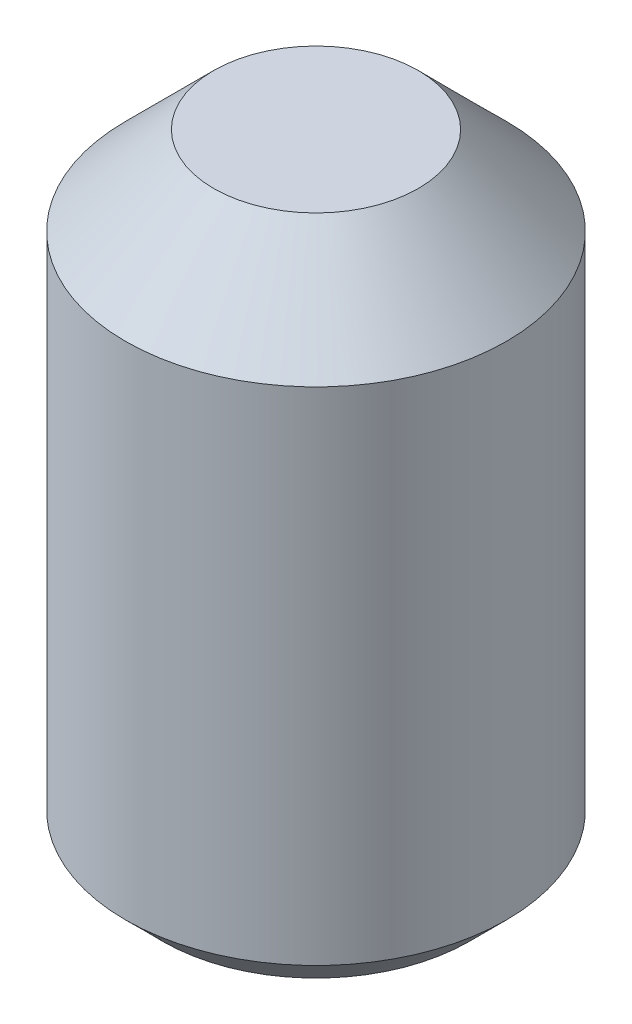
ISO-10303-21;
HEADER;
FILE_DESCRIPTION(('STEP AP214'),'2;1');
FILE_NAME('part.step','',(''),(''),'','','');
FILE_SCHEMA(('AUTOMOTIVE_DESIGN { 1 0 10303 214 1 1 1 1 }'));
ENDSEC;
DATA;
#1=APPLICATION_CONTEXT('core data for automotive mechanical design processes');
#2=APPLICATION_PROTOCOL_DEFINITION('international standard','automotive_design',2000,#1);
#3=PRODUCT_CONTEXT('',#1,'mechanical');
#4=PRODUCT('Part','Part','',(#3));
#5=PRODUCT_RELATED_PRODUCT_CATEGORY('part','',(#4));
#6=PRODUCT_DEFINITION_FORMATION('','',#4);
#7=PRODUCT_DEFINITION_CONTEXT('part definition',#1,'design');
#8=PRODUCT_DEFINITION('design','',#6,#7);
#9=PRODUCT_DEFINITION_SHAPE('','',#8);
#10=(LENGTH_UNIT() NAMED_UNIT(*) SI_UNIT(.MILLI.,.METRE.));
#11=(NAMED_UNIT(*) PLANE_ANGLE_UNIT() SI_UNIT($,.RADIAN.));
#12=(NAMED_UNIT(*) SI_UNIT($,.STERADIAN.) SOLID_ANGLE_UNIT());
#13=UNCERTAINTY_MEASURE_WITH_UNIT(LENGTH_MEASURE(1.E-05),#10,'distance_accuracy_value','');
#14=(GEOMETRIC_REPRESENTATION_CONTEXT(3) GLOBAL_UNCERTAINTY_ASSIGNED_CONTEXT((#13)) GLOBAL_UNIT_ASSIGNED_CONTEXT((#10,
#11,#12)) REPRESENTATION_CONTEXT('',''));
#15=CARTESIAN_POINT('',(0.,0.,0.));
#16=DIRECTION('',(0.,0.,1.));
#17=DIRECTION('',(1.,0.,0.));
#18=AXIS2_PLACEMENT_3D('',#15,#16,#17);
#19=CARTESIAN_POINT('',(0.,0.,0.));
#20=DIRECTION('',(0.,1.,0.));
#21=DIRECTION('',(-1.,0.,0.));
#22=AXIS2_PLACEMENT_3D('',#19,#20,#21);
#23=CYLINDRICAL_SURFACE('',#22,2.413);
#24=CARTESIAN_POINT('',(0.,0.472439999953159,0.));
#25=DIRECTION('',(0.,-1.,0.));
#26=DIRECTION('',(1.,0.,0.));
#27=AXIS2_PLACEMENT_3D('',#24,#25,#26);
#28=CIRCLE('',#27,2.413);
#29=CARTESIAN_POINT('',(2.413,0.472439999953159,0.));
#30=VERTEX_POINT('',#29);
#31=EDGE_CURVE('E45',#30,#30,#28,.F.);
#32=ORIENTED_EDGE('',*,*,#31,.T.);
#33=EDGE_LOOP('',(#32));
#34=FACE_BOUND('',#33,.T.);
#35=CARTESIAN_POINT('',(0.,6.8199,0.));
#36=DIRECTION('',(0.,1.,0.));
#37=DIRECTION('',(-1.,0.,0.));
#38=AXIS2_PLACEMENT_3D('',#35,#36,#37);
#39=CIRCLE('',#38,2.413);
#40=CARTESIAN_POINT('',(-2.413,6.8199,0.));
#41=VERTEX_POINT('',#40);
#42=EDGE_CURVE('E156',#41,#41,#39,.T.);
#43=ORIENTED_EDGE('',*,*,#42,.F.);
#44=EDGE_LOOP('',(#43));
#45=FACE_BOUND('',#44,.T.);
#46=ADVANCED_FACE('F36',(#34,#45),#23,.T.);
#47=CARTESIAN_POINT('',(2.413,0.,0.));
#48=DIRECTION('',(0.,-1.,0.));
#49=DIRECTION('',(1.,0.,0.));
#50=AXIS2_PLACEMENT_3D('',#47,#48,#49);
#51=PLANE('',#50);
#52=CARTESIAN_POINT('',(0.,0.,0.));
#53=DIRECTION('',(0.,-1.,0.));
#54=DIRECTION('',(1.,0.,0.));
#55=AXIS2_PLACEMENT_3D('',#52,#53,#54);
#56=CIRCLE('',#55,1.94056000004684);
#57=CARTESIAN_POINT('',(1.94056000004684,0.,0.));
#58=VERTEX_POINT('',#57);
#59=EDGE_CURVE('E11',#58,#58,#56,.T.);
#60=ORIENTED_EDGE('',*,*,#59,.T.);
#61=EDGE_LOOP('',(#60));
#62=FACE_BOUND('',#61,.T.);
#63=DIRECTION('',(-1.,0.,0.));
#64=VECTOR('',#63,1.);
#65=CARTESIAN_POINT('',(0.687040789999955,0.,1.18998955515204));
#66=LINE('',#65,#64);
#67=CARTESIAN_POINT('',(0.687040789999955,0.,1.18998955515204));
#68=VERTEX_POINT('',#67);
#69=CARTESIAN_POINT('',(-0.687040790000067,0.,1.18998955515204));
#70=VERTEX_POINT('',#69);
#71=EDGE_CURVE('E52',#68,#70,#66,.T.);
#72=ORIENTED_EDGE('',*,*,#71,.F.);
#73=DIRECTION('',(-0.5,0.,0.866025403784439));
#74=VECTOR('',#73,1.);
#75=CARTESIAN_POINT('',(1.37408157999982,0.,0.));
#76=LINE('',#75,#74);
#77=CARTESIAN_POINT('',(1.37408157999982,0.,0.));
#78=VERTEX_POINT('',#77);
#79=EDGE_CURVE('E151',#78,#68,#76,.T.);
#80=ORIENTED_EDGE('',*,*,#79,.F.);
#81=DIRECTION('',(0.5,0.,0.866025403784439));
#82=VECTOR('',#81,1.);
#83=CARTESIAN_POINT('',(0.687040789999932,0.,-1.18998955515205));
#84=LINE('',#83,#82);
#85=CARTESIAN_POINT('',(0.687040789999932,0.,-1.18998955515205));
#86=VERTEX_POINT('',#85);
#87=EDGE_CURVE('E148',#86,#78,#84,.T.);
#88=ORIENTED_EDGE('',*,*,#87,.F.);
#89=DIRECTION('',(1.,0.,0.));
#90=VECTOR('',#89,1.);
#91=CARTESIAN_POINT('',(-0.68704079000009,0.,-1.18998955515205));
#92=LINE('',#91,#90);
#93=CARTESIAN_POINT('',(-0.68704079000009,0.,-1.18998955515205));
#94=VERTEX_POINT('',#93);
#95=EDGE_CURVE('E107',#94,#86,#92,.T.);
#96=ORIENTED_EDGE('',*,*,#95,.F.);
#97=DIRECTION('',(0.5,0.,-0.866025403784439));
#98=VECTOR('',#97,1.);
#99=CARTESIAN_POINT('',(-1.37408157999996,0.,0.));
#100=LINE('',#99,#98);
#101=CARTESIAN_POINT('',(-1.37408157999996,0.,0.));
#102=VERTEX_POINT('',#101);
#103=EDGE_CURVE('E142',#102,#94,#100,.T.);
#104=ORIENTED_EDGE('',*,*,#103,.F.);
#105=DIRECTION('',(-0.5,0.,-0.866025403784439));
#106=VECTOR('',#105,1.);
#107=CARTESIAN_POINT('',(-0.687040790000068,0.,1.18998955515204));
#108=LINE('',#107,#106);
#109=EDGE_CURVE('E139',#70,#102,#108,.T.);
#110=ORIENTED_EDGE('',*,*,#109,.F.);
#111=EDGE_LOOP('',(#72,#80,#88,#96,#104,#110));
#112=FACE_BOUND('',#111,.T.);
#113=ADVANCED_FACE('F185',(#62,#112),#51,.T.);
#114=CARTESIAN_POINT('',(0.,7.93749999998251,0.));
#115=DIRECTION('',(0.,1.,0.));
#116=DIRECTION('',(-1.,0.,0.));
#117=AXIS2_PLACEMENT_3D('',#114,#115,#116);
#118=PLANE('',#117);
#119=CARTESIAN_POINT('',(0.,7.93749999998251,0.));
#120=DIRECTION('',(0.,1.,0.));
#121=DIRECTION('',(-1.,0.,0.));
#122=AXIS2_PLACEMENT_3D('',#119,#120,#121);
#123=CIRCLE('',#122,1.29540000001749);
#124=CARTESIAN_POINT('',(-1.29540000001749,7.93749999998251,0.));
#125=VERTEX_POINT('',#124);
#126=EDGE_CURVE('E167',#125,#125,#123,.T.);
#127=ORIENTED_EDGE('',*,*,#126,.T.);
#128=EDGE_LOOP('',(#127));
#129=FACE_BOUND('',#128,.T.);
#130=ADVANCED_FACE('F189',(#129),#118,.T.);
#131=CARTESIAN_POINT('',(0.,7.93749999998251,0.));
#132=DIRECTION('',(0.,-1.,0.));
#133=DIRECTION('',(1.,0.,0.));
#134=AXIS2_PLACEMENT_3D('',#131,#132,#133);
#135=CONICAL_SURFACE('',#134,1.29540000001749,0.785398163397448);
#136=ORIENTED_EDGE('',*,*,#42,.T.);
#137=EDGE_LOOP('',(#136));
#138=FACE_BOUND('',#137,.T.);
#139=ORIENTED_EDGE('',*,*,#126,.F.);
#140=EDGE_LOOP('',(#139));
#141=FACE_BOUND('',#140,.T.);
#142=ADVANCED_FACE('F195',(#138,#141),#135,.T.);
#143=CARTESIAN_POINT('',(0.687040789999955,2.54,1.18998955515204));
#144=DIRECTION('',(0.,0.,1.));
#145=DIRECTION('',(1.,0.,0.));
#146=AXIS2_PLACEMENT_3D('',#143,#144,#145);
#147=PLANE('',#146);
#148=ORIENTED_EDGE('',*,*,#71,.T.);
#149=DIRECTION('',(0.,-1.,0.));
#150=VECTOR('',#149,1.);
#151=CARTESIAN_POINT('',(-0.687040790000068,2.54,1.18998955515204));
#152=LINE('',#151,#150);
#153=CARTESIAN_POINT('',(-0.687040790000068,2.54,1.18998955515204));
#154=VERTEX_POINT('',#153);
#155=EDGE_CURVE('E86',#154,#70,#152,.T.);
#156=ORIENTED_EDGE('',*,*,#155,.F.);
#157=DIRECTION('',(-1.,0.,0.));
#158=VECTOR('',#157,1.);
#159=CARTESIAN_POINT('',(0.687040789999955,2.54,1.18998955515204));
#160=LINE('',#159,#158);
#161=CARTESIAN_POINT('',(0.687040789999955,2.54,1.18998955515204));
#162=VERTEX_POINT('',#161);
#163=EDGE_CURVE('E154',#162,#154,#160,.T.);
#164=ORIENTED_EDGE('',*,*,#163,.F.);
#165=DIRECTION('',(0.,-1.,0.));
#166=VECTOR('',#165,1.);
#167=CARTESIAN_POINT('',(0.687040789999955,2.54,1.18998955515204));
#168=LINE('',#167,#166);
#169=EDGE_CURVE('E60',#162,#68,#168,.T.);
#170=ORIENTED_EDGE('',*,*,#169,.T.);
#171=EDGE_LOOP('',(#148,#156,#164,#170));
#172=FACE_BOUND('',#171,.T.);
#173=ADVANCED_FACE('F199',(#172),#147,.F.);
#174=CARTESIAN_POINT('',(1.37408157999982,2.54,0.));
#175=DIRECTION('',(0.866025403784439,0.,0.5));
#176=DIRECTION('',(0.5,0.,-0.866025403784439));
#177=AXIS2_PLACEMENT_3D('',#174,#175,#176);
#178=PLANE('',#177);
#179=ORIENTED_EDGE('',*,*,#79,.T.);
#180=ORIENTED_EDGE('',*,*,#169,.F.);
#181=DIRECTION('',(-0.5,0.,0.866025403784439));
#182=VECTOR('',#181,1.);
#183=CARTESIAN_POINT('',(1.37408157999982,2.54,0.));
#184=LINE('',#183,#182);
#185=CARTESIAN_POINT('',(1.37408157999982,2.54,0.));
#186=VERTEX_POINT('',#185);
#187=EDGE_CURVE('E121',#186,#162,#184,.T.);
#188=ORIENTED_EDGE('',*,*,#187,.F.);
#189=DIRECTION('',(0.,-1.,0.));
#190=VECTOR('',#189,1.);
#191=CARTESIAN_POINT('',(1.37408157999982,2.54,0.));
#192=LINE('',#191,#190);
#193=EDGE_CURVE('E112',#186,#78,#192,.T.);
#194=ORIENTED_EDGE('',*,*,#193,.T.);
#195=EDGE_LOOP('',(#179,#180,#188,#194));
#196=FACE_BOUND('',#195,.T.);
#197=ADVANCED_FACE('F203',(#196),#178,.F.);
#198=CARTESIAN_POINT('',(0.687040789999932,2.54,-1.18998955515205));
#199=DIRECTION('',(0.866025403784439,0.,-0.5));
#200=DIRECTION('',(-0.5,0.,-0.866025403784439));
#201=AXIS2_PLACEMENT_3D('',#198,#199,#200);
#202=PLANE('',#201);
#203=ORIENTED_EDGE('',*,*,#87,.T.);
#204=ORIENTED_EDGE('',*,*,#193,.F.);
#205=DIRECTION('',(0.5,0.,0.866025403784439));
#206=VECTOR('',#205,1.);
#207=CARTESIAN_POINT('',(0.687040789999932,2.54,-1.18998955515205));
#208=LINE('',#207,#206);
#209=CARTESIAN_POINT('',(0.687040789999932,2.54,-1.18998955515205));
#210=VERTEX_POINT('',#209);
#211=EDGE_CURVE('E116',#210,#186,#208,.T.);
#212=ORIENTED_EDGE('',*,*,#211,.F.);
#213=DIRECTION('',(0.,-1.,0.));
#214=VECTOR('',#213,1.);
#215=CARTESIAN_POINT('',(0.687040789999932,2.54,-1.18998955515205));
#216=LINE('',#215,#214);
#217=EDGE_CURVE('E100',#210,#86,#216,.T.);
#218=ORIENTED_EDGE('',*,*,#217,.T.);
#219=EDGE_LOOP('',(#203,#204,#212,#218));
#220=FACE_BOUND('',#219,.T.);
#221=ADVANCED_FACE('F117',(#220),#202,.F.);
#222=CARTESIAN_POINT('',(-0.68704079000009,2.54,-1.18998955515205));
#223=DIRECTION('',(0.,0.,-1.));
#224=DIRECTION('',(-1.,0.,0.));
#225=AXIS2_PLACEMENT_3D('',#222,#223,#224);
#226=PLANE('',#225);
#227=ORIENTED_EDGE('',*,*,#95,.T.);
#228=ORIENTED_EDGE('',*,*,#217,.F.);
#229=DIRECTION('',(1.,0.,0.));
#230=VECTOR('',#229,1.);
#231=CARTESIAN_POINT('',(-0.68704079000009,2.54,-1.18998955515205));
#232=LINE('',#231,#230);
#233=CARTESIAN_POINT('',(-0.68704079000009,2.54,-1.18998955515205));
#234=VERTEX_POINT('',#233);
#235=EDGE_CURVE('E104',#234,#210,#232,.T.);
#236=ORIENTED_EDGE('',*,*,#235,.F.);
#237=DIRECTION('',(0.,-1.,0.));
#238=VECTOR('',#237,1.);
#239=CARTESIAN_POINT('',(-0.68704079000009,2.54,-1.18998955515205));
#240=LINE('',#239,#238);
#241=EDGE_CURVE('E113',#234,#94,#240,.T.);
#242=ORIENTED_EDGE('',*,*,#241,.T.);
#243=EDGE_LOOP('',(#227,#228,#236,#242));
#244=FACE_BOUND('',#243,.T.);
#245=ADVANCED_FACE('F102',(#244),#226,.F.);
#246=CARTESIAN_POINT('',(-1.37408157999996,2.54,0.));
#247=DIRECTION('',(-0.866025403784439,0.,-0.5));
#248=DIRECTION('',(-0.5,0.,0.866025403784439));
#249=AXIS2_PLACEMENT_3D('',#246,#247,#248);
#250=PLANE('',#249);
#251=ORIENTED_EDGE('',*,*,#103,.T.);
#252=ORIENTED_EDGE('',*,*,#241,.F.);
#253=DIRECTION('',(0.5,0.,-0.866025403784439));
#254=VECTOR('',#253,1.);
#255=CARTESIAN_POINT('',(-1.37408157999996,2.54,0.));
#256=LINE('',#255,#254);
#257=CARTESIAN_POINT('',(-1.37408157999996,2.54,0.));
#258=VERTEX_POINT('',#257);
#259=EDGE_CURVE('E127',#258,#234,#256,.T.);
#260=ORIENTED_EDGE('',*,*,#259,.F.);
#261=DIRECTION('',(0.,-1.,0.));
#262=VECTOR('',#261,1.);
#263=CARTESIAN_POINT('',(-1.37408157999996,2.54,0.));
#264=LINE('',#263,#262);
#265=EDGE_CURVE('E161',#258,#102,#264,.T.);
#266=ORIENTED_EDGE('',*,*,#265,.T.);
#267=EDGE_LOOP('',(#251,#252,#260,#266));
#268=FACE_BOUND('',#267,.T.);
#269=ADVANCED_FACE('F206',(#268),#250,.F.);
#270=CARTESIAN_POINT('',(-0.687040790000068,2.54,1.18998955515204));
#271=DIRECTION('',(-0.866025403784439,0.,0.5));
#272=DIRECTION('',(0.5,0.,0.866025403784439));
#273=AXIS2_PLACEMENT_3D('',#270,#271,#272);
#274=PLANE('',#273);
#275=ORIENTED_EDGE('',*,*,#109,.T.);
#276=ORIENTED_EDGE('',*,*,#265,.F.);
#277=DIRECTION('',(-0.5,0.,-0.866025403784439));
#278=VECTOR('',#277,1.);
#279=CARTESIAN_POINT('',(-0.687040790000068,2.54,1.18998955515204));
#280=LINE('',#279,#278);
#281=EDGE_CURVE('E132',#154,#258,#280,.T.);
#282=ORIENTED_EDGE('',*,*,#281,.F.);
#283=ORIENTED_EDGE('',*,*,#155,.T.);
#284=EDGE_LOOP('',(#275,#276,#282,#283));
#285=FACE_BOUND('',#284,.T.);
#286=ADVANCED_FACE('F181',(#285),#274,.F.);
#287=CARTESIAN_POINT('',(0.,2.54,0.));
#288=DIRECTION('',(0.,-1.,0.));
#289=DIRECTION('',(0.,0.,-1.));
#290=AXIS2_PLACEMENT_3D('',#287,#288,#289);
#291=PLANE('',#290);
#292=ORIENTED_EDGE('',*,*,#163,.T.);
#293=ORIENTED_EDGE('',*,*,#281,.T.);
#294=ORIENTED_EDGE('',*,*,#259,.T.);
#295=ORIENTED_EDGE('',*,*,#235,.T.);
#296=ORIENTED_EDGE('',*,*,#211,.T.);
#297=ORIENTED_EDGE('',*,*,#187,.T.);
#298=EDGE_LOOP('',(#292,#293,#294,#295,#296,#297));
#299=FACE_BOUND('',#298,.T.);
#300=ADVANCED_FACE('F124',(#299),#291,.T.);
#301=CARTESIAN_POINT('',(0.,0.472439999953159,0.));
#302=DIRECTION('',(0.,1.,0.));
#303=DIRECTION('',(-1.,0.,0.));
#304=AXIS2_PLACEMENT_3D('',#301,#302,#303);
#305=CONICAL_SURFACE('',#304,2.413,0.785398163397451);
#306=ORIENTED_EDGE('',*,*,#59,.F.);
#307=EDGE_LOOP('',(#306));
#308=FACE_BOUND('',#307,.T.);
#309=ORIENTED_EDGE('',*,*,#31,.F.);
#310=EDGE_LOOP('',(#309));
#311=FACE_BOUND('',#310,.T.);
#312=ADVANCED_FACE('F38',(#308,#311),#305,.T.);
#313=CLOSED_SHELL('',(#46,#113,#130,#142,#173,#197,#221,#245,#269,#286,#300,#312));
#314=MANIFOLD_SOLID_BREP('B2',#313);
#315=ADVANCED_BREP_SHAPE_REPRESENTATION('',(#18,#314),#14);
#316=SHAPE_DEFINITION_REPRESENTATION(#9,#315);
ENDSEC;
END-ISO-10303-21;
